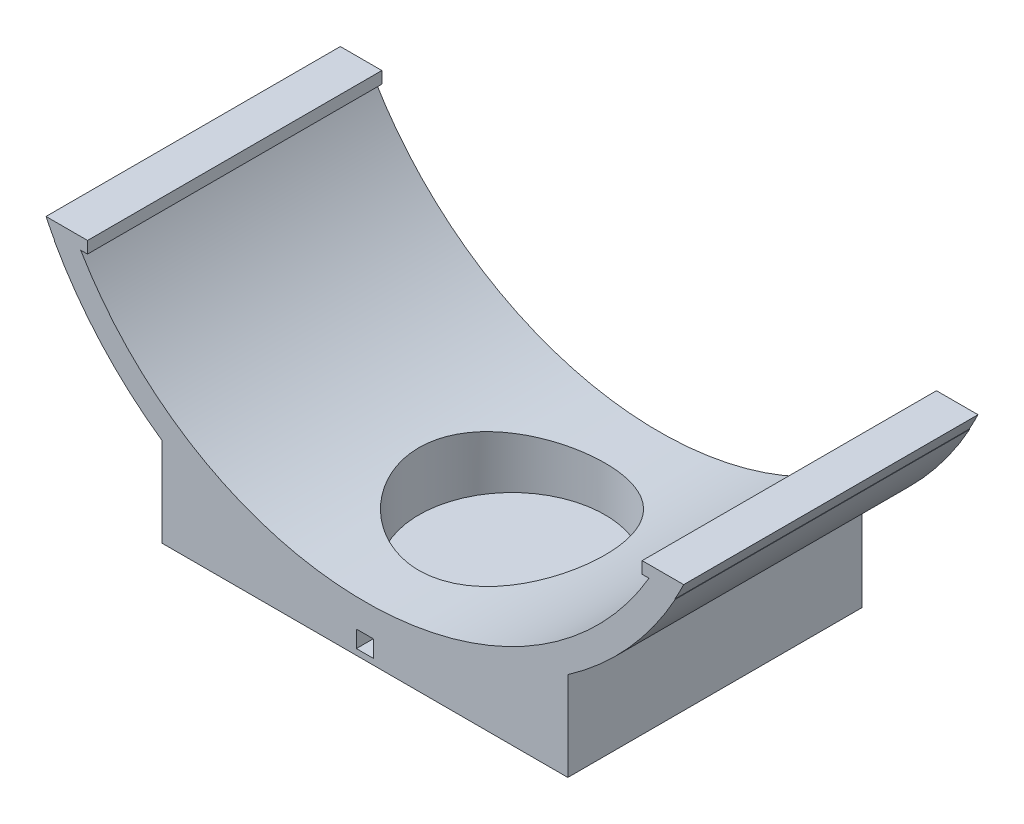
ISO-10303-21;
HEADER;
FILE_DESCRIPTION(('STEP AP214'),'2;1');
FILE_NAME('part.step','',(''),(''),'','','');
FILE_SCHEMA(('AUTOMOTIVE_DESIGN { 1 0 10303 214 1 1 1 1 }'));
ENDSEC;
DATA;
#1=APPLICATION_CONTEXT('core data for automotive mechanical design processes');
#2=APPLICATION_PROTOCOL_DEFINITION('international standard','automotive_design',2000,#1);
#3=PRODUCT_CONTEXT('',#1,'mechanical');
#4=PRODUCT('Part','Part','',(#3));
#5=PRODUCT_RELATED_PRODUCT_CATEGORY('part','',(#4));
#6=PRODUCT_DEFINITION_FORMATION('','',#4);
#7=PRODUCT_DEFINITION_CONTEXT('part definition',#1,'design');
#8=PRODUCT_DEFINITION('design','',#6,#7);
#9=PRODUCT_DEFINITION_SHAPE('','',#8);
#10=(LENGTH_UNIT() NAMED_UNIT(*) SI_UNIT(.MILLI.,.METRE.));
#11=(NAMED_UNIT(*) PLANE_ANGLE_UNIT() SI_UNIT($,.RADIAN.));
#12=(NAMED_UNIT(*) SI_UNIT($,.STERADIAN.) SOLID_ANGLE_UNIT());
#13=UNCERTAINTY_MEASURE_WITH_UNIT(LENGTH_MEASURE(1.E-05),#10,'distance_accuracy_value','');
#14=(GEOMETRIC_REPRESENTATION_CONTEXT(3) GLOBAL_UNCERTAINTY_ASSIGNED_CONTEXT((#13)) GLOBAL_UNIT_ASSIGNED_CONTEXT((#10,
#11,#12)) REPRESENTATION_CONTEXT('',''));
#15=CARTESIAN_POINT('',(0.,0.,0.));
#16=DIRECTION('',(0.,0.,1.));
#17=DIRECTION('',(1.,0.,0.));
#18=AXIS2_PLACEMENT_3D('',#15,#16,#17);
#19=CARTESIAN_POINT('',(0.,0.,174.));
#20=DIRECTION('',(0.,0.,1.));
#21=DIRECTION('',(1.,0.,0.));
#22=AXIS2_PLACEMENT_3D('',#19,#20,#21);
#23=PLANE('',#22);
#24=DIRECTION('',(0.,1.,0.));
#25=VECTOR('',#24,1.);
#26=CARTESIAN_POINT('',(-120.,0.,174.));
#27=LINE('',#26,#25);
#28=CARTESIAN_POINT('',(-120.,-225.,174.));
#29=VERTEX_POINT('',#28);
#30=CARTESIAN_POINT('',(-120.,-172.336879396141,174.));
#31=VERTEX_POINT('',#30);
#32=EDGE_CURVE('E302',#29,#31,#27,.T.);
#33=ORIENTED_EDGE('',*,*,#32,.F.);
#34=DIRECTION('',(1.,0.,0.));
#35=VECTOR('',#34,1.);
#36=CARTESIAN_POINT('',(0.,-225.,174.));
#37=LINE('',#36,#35);
#38=CARTESIAN_POINT('',(120.,-225.,174.));
#39=VERTEX_POINT('',#38);
#40=EDGE_CURVE('E217',#29,#39,#37,.T.);
#41=ORIENTED_EDGE('',*,*,#40,.T.);
#42=DIRECTION('',(0.,1.,0.));
#43=VECTOR('',#42,1.);
#44=CARTESIAN_POINT('',(120.,0.,174.));
#45=LINE('',#44,#43);
#46=CARTESIAN_POINT('',(120.,-172.336879396141,174.));
#47=VERTEX_POINT('',#46);
#48=EDGE_CURVE('E293',#39,#47,#45,.T.);
#49=ORIENTED_EDGE('',*,*,#48,.T.);
#50=CARTESIAN_POINT('',(0.,0.,174.));
#51=DIRECTION('',(0.,0.,1.));
#52=DIRECTION('',(1.,0.,0.));
#53=AXIS2_PLACEMENT_3D('',#50,#51,#52);
#54=CIRCLE('',#53,210.);
#55=CARTESIAN_POINT('',(183.56470248934,-102.,174.));
#56=VERTEX_POINT('',#55);
#57=EDGE_CURVE('E327',#47,#56,#54,.T.);
#58=ORIENTED_EDGE('',*,*,#57,.T.);
#59=DIRECTION('',(1.,0.,0.));
#60=VECTOR('',#59,1.);
#61=CARTESIAN_POINT('',(0.,-102.,174.));
#62=LINE('',#61,#60);
#63=CARTESIAN_POINT('',(183.278647146906,-102.,174.));
#64=VERTEX_POINT('',#63);
#65=EDGE_CURVE('E315',#64,#56,#62,.T.);
#66=ORIENTED_EDGE('',*,*,#65,.F.);
#67=CARTESIAN_POINT('',(0.,0.,174.));
#68=DIRECTION('',(0.,0.,1.));
#69=DIRECTION('',(1.,0.,0.));
#70=AXIS2_PLACEMENT_3D('',#67,#68,#69);
#71=CIRCLE('',#70,209.75);
#72=CARTESIAN_POINT('',(188.496850106308,-92.0000000000001,174.));
#73=VERTEX_POINT('',#72);
#74=EDGE_CURVE('E277',#64,#73,#71,.T.);
#75=ORIENTED_EDGE('',*,*,#74,.T.);
#76=DIRECTION('',(-1.,0.,0.));
#77=VECTOR('',#76,1.);
#78=CARTESIAN_POINT('',(171.933126534708,-92.,174.));
#79=LINE('',#78,#77);
#80=CARTESIAN_POINT('',(163.933126534708,-92.,174.));
#81=VERTEX_POINT('',#80);
#82=EDGE_CURVE('E281',#73,#81,#79,.T.);
#83=ORIENTED_EDGE('',*,*,#82,.T.);
#84=DIRECTION('',(0.,1.,0.));
#85=VECTOR('',#84,1.);
#86=CARTESIAN_POINT('',(163.933126534708,-92.,174.));
#87=LINE('',#86,#85);
#88=CARTESIAN_POINT('',(163.933126534708,-99.,174.));
#89=VERTEX_POINT('',#88);
#90=EDGE_CURVE('E235',#89,#81,#87,.T.);
#91=ORIENTED_EDGE('',*,*,#90,.F.);
#92=DIRECTION('',(-1.,0.,0.));
#93=VECTOR('',#92,1.);
#94=CARTESIAN_POINT('',(163.933126534708,-99.,174.));
#95=LINE('',#94,#93);
#96=CARTESIAN_POINT('',(168.,-99.,174.));
#97=VERTEX_POINT('',#96);
#98=EDGE_CURVE('E229',#97,#89,#95,.T.);
#99=ORIENTED_EDGE('',*,*,#98,.F.);
#100=CARTESIAN_POINT('',(0.,0.,174.));
#101=DIRECTION('',(0.,0.,-1.));
#102=DIRECTION('',(1.,0.,0.));
#103=AXIS2_PLACEMENT_3D('',#100,#101,#102);
#104=CIRCLE('',#103,195.);
#105=CARTESIAN_POINT('',(-168.,-99.,174.));
#106=VERTEX_POINT('',#105);
#107=EDGE_CURVE('E289',#97,#106,#104,.T.);
#108=ORIENTED_EDGE('',*,*,#107,.T.);
#109=DIRECTION('',(-1.,0.,0.));
#110=VECTOR('',#109,1.);
#111=CARTESIAN_POINT('',(-163.933126534708,-99.,174.));
#112=LINE('',#111,#110);
#113=CARTESIAN_POINT('',(-163.933126534708,-99.,174.));
#114=VERTEX_POINT('',#113);
#115=EDGE_CURVE('E252',#114,#106,#112,.T.);
#116=ORIENTED_EDGE('',*,*,#115,.F.);
#117=DIRECTION('',(0.,-1.,0.));
#118=VECTOR('',#117,1.);
#119=CARTESIAN_POINT('',(-163.933126534708,-92.,174.));
#120=LINE('',#119,#118);
#121=CARTESIAN_POINT('',(-163.933126534708,-92.,174.));
#122=VERTEX_POINT('',#121);
#123=EDGE_CURVE('E257',#122,#114,#120,.T.);
#124=ORIENTED_EDGE('',*,*,#123,.F.);
#125=DIRECTION('',(-1.,0.,0.));
#126=VECTOR('',#125,1.);
#127=CARTESIAN_POINT('',(-188.496850106308,-92.,174.));
#128=LINE('',#127,#126);
#129=CARTESIAN_POINT('',(-188.496850106308,-92.,174.));
#130=VERTEX_POINT('',#129);
#131=EDGE_CURVE('E261',#122,#130,#128,.T.);
#132=ORIENTED_EDGE('',*,*,#131,.T.);
#133=CARTESIAN_POINT('',(-183.278647146906,-102.,174.));
#134=VERTEX_POINT('',#133);
#135=EDGE_CURVE('E278',#130,#134,#71,.T.);
#136=ORIENTED_EDGE('',*,*,#135,.T.);
#137=DIRECTION('',(1.,0.,0.));
#138=VECTOR('',#137,1.);
#139=CARTESIAN_POINT('',(0.,-102.,174.));
#140=LINE('',#139,#138);
#141=CARTESIAN_POINT('',(-183.56470248934,-102.,174.));
#142=VERTEX_POINT('',#141);
#143=EDGE_CURVE('E318',#142,#134,#140,.T.);
#144=ORIENTED_EDGE('',*,*,#143,.F.);
#145=EDGE_CURVE('E324',#142,#31,#54,.T.);
#146=ORIENTED_EDGE('',*,*,#145,.T.);
#147=EDGE_LOOP('',(#33,#41,#49,#58,#66,#75,#83,#91,#99,#108,#116,#124,#132,#136,#144,#146));
#148=FACE_BOUND('',#147,.T.);
#149=DIRECTION('',(0.,-1.,0.));
#150=VECTOR('',#149,1.);
#151=CARTESIAN_POINT('',(5.00000000000002,0.,174.));
#152=LINE('',#151,#150);
#153=CARTESIAN_POINT('',(5.,-211.5,174.));
#154=VERTEX_POINT('',#153);
#155=CARTESIAN_POINT('',(5.,-221.5,174.));
#156=VERTEX_POINT('',#155);
#157=EDGE_CURVE('E191',#154,#156,#152,.T.);
#158=ORIENTED_EDGE('',*,*,#157,.T.);
#159=DIRECTION('',(-1.,0.,0.));
#160=VECTOR('',#159,1.);
#161=CARTESIAN_POINT('',(0.,-221.5,174.));
#162=LINE('',#161,#160);
#163=CARTESIAN_POINT('',(-5.,-221.5,174.));
#164=VERTEX_POINT('',#163);
#165=EDGE_CURVE('E59',#156,#164,#162,.T.);
#166=ORIENTED_EDGE('',*,*,#165,.T.);
#167=DIRECTION('',(0.,1.,0.));
#168=VECTOR('',#167,1.);
#169=CARTESIAN_POINT('',(-5.,0.,174.));
#170=LINE('',#169,#168);
#171=CARTESIAN_POINT('',(-5.,-211.5,174.));
#172=VERTEX_POINT('',#171);
#173=EDGE_CURVE('E196',#164,#172,#170,.T.);
#174=ORIENTED_EDGE('',*,*,#173,.T.);
#175=DIRECTION('',(1.,0.,0.));
#176=VECTOR('',#175,1.);
#177=CARTESIAN_POINT('',(0.,-211.5,174.));
#178=LINE('',#177,#176);
#179=EDGE_CURVE('E183',#172,#154,#178,.T.);
#180=ORIENTED_EDGE('',*,*,#179,.T.);
#181=EDGE_LOOP('',(#158,#166,#174,#180));
#182=FACE_BOUND('',#181,.T.);
#183=ADVANCED_FACE('F44',(#148,#182),#23,.T.);
#184=CARTESIAN_POINT('',(0.,-221.5,87.));
#185=DIRECTION('',(0.,1.,0.));
#186=DIRECTION('',(0.,0.,1.));
#187=AXIS2_PLACEMENT_3D('',#184,#185,#186);
#188=CYLINDRICAL_SURFACE('',#187,55.);
#189=CARTESIAN_POINT('',(0.,-195.,142.));
#190=CARTESIAN_POINT('',(1.51277598464168,-194.999997304751,141.999995610297));
#191=CARTESIAN_POINT('',(3.02563306617673,-194.982353560653,141.93753465475));
#192=CARTESIAN_POINT('',(6.04030681610823,-194.912258782389,141.688232088754));
#193=CARTESIAN_POINT('',(7.54212268342941,-194.859805247374,141.501381541749));
#194=CARTESIAN_POINT('',(10.5242864998696,-194.721514711655,141.004861870919));
#195=CARTESIAN_POINT('',(12.0046267379808,-194.635666013523,140.69514971122));
#196=CARTESIAN_POINT('',(14.9327576670529,-194.432936319551,139.955576125098));
#197=CARTESIAN_POINT('',(16.3805488217454,-194.316055766129,139.525716411608));
#198=CARTESIAN_POINT('',(19.2316449690921,-194.054606947669,138.550081244053));
#199=CARTESIAN_POINT('',(20.6350093429244,-193.910077631711,138.004468735609));
#200=CARTESIAN_POINT('',(23.3900720949104,-193.597073533787,136.80124640194));
#201=CARTESIAN_POINT('',(24.7417703476622,-193.428598693706,136.143636304901));
#202=CARTESIAN_POINT('',(27.3849321959632,-193.072121722803,134.72125352611));
#203=CARTESIAN_POINT('',(28.6763923140339,-192.884118466645,133.956474667808));
#204=CARTESIAN_POINT('',(31.1910004963923,-192.493482436804,132.32513389038));
#205=CARTESIAN_POINT('',(32.4141473302252,-192.290849399763,131.458570138783));
#206=CARTESIAN_POINT('',(34.8121052649309,-191.871397239887,129.608255675445));
#207=CARTESIAN_POINT('',(35.985145512741,-191.654358471269,128.62225916456));
#208=CARTESIAN_POINT('',(38.2445264347831,-191.21631917666,126.556283582681));
#209=CARTESIAN_POINT('',(39.3308658605527,-190.995318593676,125.47630315882));
#210=CARTESIAN_POINT('',(41.4100573863605,-190.555337694959,123.229140506784));
#211=CARTESIAN_POINT('',(42.4028965244983,-190.336357663118,122.061946228299));
#212=CARTESIAN_POINT('',(44.2884084378103,-189.906482695444,119.647858408345));
#213=CARTESIAN_POINT('',(45.181080405655,-189.695587824785,118.400964224635));
#214=CARTESIAN_POINT('',(46.8765745407372,-189.283815921787,115.810239545886));
#215=CARTESIAN_POINT('',(47.6772977159791,-189.083215525293,114.464990030597));
#216=CARTESIAN_POINT('',(49.162230637943,-188.702577945346,111.708813244506));
#217=CARTESIAN_POINT('',(49.8464384655657,-188.522541100608,110.297884892409));
#218=CARTESIAN_POINT('',(51.0927350973465,-188.188599218257,107.42034060372));
#219=CARTESIAN_POINT('',(51.6548437850889,-188.034689926722,105.953733780017));
#220=CARTESIAN_POINT('',(52.6522576710364,-187.757844041035,102.97517381577));
#221=CARTESIAN_POINT('',(53.0875668143327,-187.634906483282,101.46322208765));
#222=CARTESIAN_POINT('',(53.8181863976163,-187.426635157743,98.4435623179981));
#223=CARTESIAN_POINT('',(54.1167289707947,-187.340437004747,96.936695711525));
#224=CARTESIAN_POINT('',(54.586856670881,-187.203993562236,93.9016672922743));
#225=CARTESIAN_POINT('',(54.75844373239,-187.153747724864,92.3735058043586));
#226=CARTESIAN_POINT('',(54.9730432374301,-187.090825739297,89.3076899008145));
#227=CARTESIAN_POINT('',(55.0160792915418,-187.078142692059,87.7700372803878));
#228=CARTESIAN_POINT('',(54.9732343190708,-187.09073748328,84.6967010099465));
#229=CARTESIAN_POINT('',(54.887355681379,-187.116014618306,83.1610173239737));
#230=CARTESIAN_POINT('',(54.5922403009783,-187.202323309921,80.1515882440086));
#231=CARTESIAN_POINT('',(54.3869816817835,-187.262201453032,78.6774175080696));
#232=CARTESIAN_POINT('',(53.8581194766046,-187.41499037387,75.7522458772274));
#233=CARTESIAN_POINT('',(53.5345187495676,-187.507900353601,74.3012444234769));
#234=CARTESIAN_POINT('',(52.7716565927596,-187.724024039912,71.4322191048295));
#235=CARTESIAN_POINT('',(52.3323881639886,-187.847239580238,70.0141972411653));
#236=CARTESIAN_POINT('',(51.3416985166608,-188.120423591712,67.2205508089576));
#237=CARTESIAN_POINT('',(50.7902750928457,-188.270392588895,65.8449270746838));
#238=CARTESIAN_POINT('',(49.5719407427942,-188.594869390542,63.1281257936024));
#239=CARTESIAN_POINT('',(48.9036859021021,-188.769657733188,61.7875846456117));
#240=CARTESIAN_POINT('',(47.4613520849324,-189.137446531583,59.1673453312611));
#241=CARTESIAN_POINT('',(46.6872726568405,-189.330447065053,57.8876474245857));
#242=CARTESIAN_POINT('',(45.0384344896766,-189.729435603099,55.3966655699284));
#243=CARTESIAN_POINT('',(44.1636575337009,-189.935425954569,54.1853940600432));
#244=CARTESIAN_POINT('',(42.3192039321344,-190.354877199058,51.838767050779));
#245=CARTESIAN_POINT('',(41.3495249884407,-190.568338272905,50.7034133909127));
#246=CARTESIAN_POINT('',(39.2840355631165,-191.005023396751,48.475253402716));
#247=CARTESIAN_POINT('',(38.1849013302693,-191.228318156092,47.3855395329822));
#248=CARTESIAN_POINT('',(35.8982517288536,-191.67073699137,45.3021832093801));
#249=CARTESIAN_POINT('',(34.7107341671541,-191.889860963646,44.3085431408805));
#250=CARTESIAN_POINT('',(32.2549075063342,-192.317899025981,42.4240354736116));
#251=CARTESIAN_POINT('',(30.9865936554316,-192.526812514263,41.5331739281184));
#252=CARTESIAN_POINT('',(28.3774891485624,-192.928639740406,39.8606401400473));
#253=CARTESIAN_POINT('',(27.0366989896612,-193.121553587973,39.0789671487516));
#254=CARTESIAN_POINT('',(24.2841503406643,-193.486995820346,37.626785886393));
#255=CARTESIAN_POINT('',(22.872049070732,-193.659409035535,36.9568978383738));
#256=CARTESIAN_POINT('',(19.9933641479954,-193.977736178376,35.7388260939951));
#257=CARTESIAN_POINT('',(18.5267800671251,-194.123649897772,35.1906433540984));
#258=CARTESIAN_POINT('',(15.5499999242052,-194.384745205353,34.2207670888056));
#259=CARTESIAN_POINT('',(14.0398126256082,-194.499932921909,33.7990483377956));
#260=CARTESIAN_POINT('',(10.9868456927494,-194.696246881347,33.0857502506882));
#261=CARTESIAN_POINT('',(9.44406710114175,-194.777374212154,32.7941667579131));
#262=CARTESIAN_POINT('',(6.38759737955367,-194.901161078377,32.3510633816287));
#263=CARTESIAN_POINT('',(4.87455911709058,-194.94497035096,32.1953533234206));
#264=CARTESIAN_POINT('',(1.84018665814559,-194.997220478891,32.0097825472414));
#265=CARTESIAN_POINT('',(0.318852639704865,-195.005662090324,31.9799191389463));
#266=CARTESIAN_POINT('',(-2.72067114375175,-194.986942029158,32.0463054967055));
#267=CARTESIAN_POINT('',(-4.23886122557451,-194.959784138108,32.1425418678469));
#268=CARTESIAN_POINT('',(-7.26103653739713,-194.870630723845,32.4602353545998));
#269=CARTESIAN_POINT('',(-8.765021849285,-194.808635401589,32.6816917478914));
#270=CARTESIAN_POINT('',(-11.7185674550566,-194.653074412565,33.2423005147627));
#271=CARTESIAN_POINT('',(-13.1686167043497,-194.560151370275,33.5790608624129));
#272=CARTESIAN_POINT('',(-16.0346101227006,-194.344941863136,34.3682562724752));
#273=CARTESIAN_POINT('',(-17.4505548668401,-194.222655893797,34.8206893828778));
#274=CARTESIAN_POINT('',(-20.239101414165,-193.951905110252,35.837693591339));
#275=CARTESIAN_POINT('',(-21.6116996780089,-193.803438164791,36.4022738191746));
#276=CARTESIAN_POINT('',(-24.3046889918928,-193.484162013078,37.6393085686977));
#277=CARTESIAN_POINT('',(-25.6250788776387,-193.313352308927,38.3117654944437));
#278=CARTESIAN_POINT('',(-28.2329132181185,-192.949922490515,39.7751609714886));
#279=CARTESIAN_POINT('',(-29.519061548626,-192.756916069748,40.5683133943173));
#280=CARTESIAN_POINT('',(-32.0203400821098,-192.35722551291,42.2565691287422));
#281=CARTESIAN_POINT('',(-33.235469482682,-192.150541222357,43.1516735919021));
#282=CARTESIAN_POINT('',(-35.5874725145358,-191.728870384718,45.0380551409026));
#283=CARTESIAN_POINT('',(-36.7243310563164,-191.513882249171,46.0293506827473));
#284=CARTESIAN_POINT('',(-38.9125867826961,-191.081278017958,48.1016524547747));
#285=CARTESIAN_POINT('',(-39.9639823382036,-190.863661872288,49.1826603942576));
#286=CARTESIAN_POINT('',(-42.0068287968446,-190.424663688709,51.4634820536823));
#287=CARTESIAN_POINT('',(-42.9953032651288,-190.203382512631,52.6659833901291));
#288=CARTESIAN_POINT('',(-44.8675674807035,-189.770453355497,55.151572228421));
#289=CARTESIAN_POINT('',(-45.7513547796848,-189.558805599808,56.4346616138977));
#290=CARTESIAN_POINT('',(-47.4079032742508,-189.151311295467,59.0730086424281));
#291=CARTESIAN_POINT('',(-48.1806657935975,-188.95546455843,60.4282654247568));
#292=CARTESIAN_POINT('',(-49.609306663953,-188.585422348909,63.2018895610344));
#293=CARTESIAN_POINT('',(-50.2651868880261,-188.41122652948,64.6202559031836));
#294=CARTESIAN_POINT('',(-51.4515194101969,-188.090714591469,67.5024025647285));
#295=CARTESIAN_POINT('',(-51.9826387878447,-187.944251048306,68.9658917148034));
#296=CARTESIAN_POINT('',(-52.9195244587185,-187.682606546131,71.935223920435));
#297=CARTESIAN_POINT('',(-53.32529079328,-187.567425576802,73.4410669620252));
#298=CARTESIAN_POINT('',(-54.0077324467009,-187.372065704206,76.4835904167211));
#299=CARTESIAN_POINT('',(-54.2844395155644,-187.291878192473,78.0202631482542));
#300=CARTESIAN_POINT('',(-54.706299470099,-187.169092825265,81.113035288433));
#301=CARTESIAN_POINT('',(-54.8514566322037,-187.126493747863,82.6691340639081));
#302=CARTESIAN_POINT('',(-55.0059350885892,-187.081140474726,85.7311540434134));
#303=CARTESIAN_POINT('',(-55.0200592029773,-187.07697748964,87.2368141228749));
#304=CARTESIAN_POINT('',(-54.9248583842064,-187.104950316674,90.2438606326164));
#305=CARTESIAN_POINT('',(-54.8155366395511,-187.137085191252,91.7452471722744));
#306=CARTESIAN_POINT('',(-54.474438998226,-187.236660182412,94.7327825235859));
#307=CARTESIAN_POINT('',(-54.242667739981,-187.304098961669,96.2189319102538));
#308=CARTESIAN_POINT('',(-53.6587131692459,-187.472223660234,99.1654548680127));
#309=CARTESIAN_POINT('',(-53.306529257297,-187.572909745057,100.625828310743));
#310=CARTESIAN_POINT('',(-52.4887374259627,-187.803383553097,103.496617769752));
#311=CARTESIAN_POINT('',(-52.0242661681516,-187.932878661644,104.907381560932));
#312=CARTESIAN_POINT('',(-50.9838485852516,-188.217793669274,107.684434863653));
#313=CARTESIAN_POINT('',(-50.4079034401043,-188.373213293946,109.050724845765));
#314=CARTESIAN_POINT('',(-49.1487429468255,-188.705656652546,111.730405540767));
#315=CARTESIAN_POINT('',(-48.4655133229456,-188.882683260896,113.043789184439));
#316=CARTESIAN_POINT('',(-46.9966216973714,-189.253510163334,115.609488643802));
#317=CARTESIAN_POINT('',(-46.2109569467775,-189.447310907518,116.861802819423));
#318=CARTESIAN_POINT('',(-44.5151536149936,-189.853062976584,119.337676095336));
#319=CARTESIAN_POINT('',(-43.6017904708369,-190.065400173821,120.558964323428));
#320=CARTESIAN_POINT('',(-41.6774853507142,-190.496612007318,122.920853720066));
#321=CARTESIAN_POINT('',(-40.66654134687,-190.715486779373,124.061453210924));
#322=CARTESIAN_POINT('',(-38.5533331692757,-191.153877639405,126.255068471827));
#323=CARTESIAN_POINT('',(-37.4510474753336,-191.373393866689,127.308063484396));
#324=CARTESIAN_POINT('',(-35.1622995871373,-191.807114286307,129.319424849606));
#325=CARTESIAN_POINT('',(-33.975836966903,-192.021318451751,130.277790723315));
#326=CARTESIAN_POINT('',(-31.4957016907239,-192.443866652879,132.116095107206));
#327=CARTESIAN_POINT('',(-30.2000984393956,-192.651933098431,132.993495252527));
#328=CARTESIAN_POINT('',(-27.5368111149729,-193.05060678832,134.63582320654));
#329=CARTESIAN_POINT('',(-26.169123975991,-193.241213289103,135.400746226079));
#330=CARTESIAN_POINT('',(-23.3717389221184,-193.599455338112,136.811793217101));
#331=CARTESIAN_POINT('',(-21.9420720610811,-193.76710221867,137.457975850282));
#332=CARTESIAN_POINT('',(-19.0302533374737,-194.074706450383,138.626638816058));
#333=CARTESIAN_POINT('',(-17.5481076720372,-194.21466705819,139.149133699094));
#334=CARTESIAN_POINT('',(-14.7498370514193,-194.445706299648,140.002612249688));
#335=CARTESIAN_POINT('',(-13.4390480304431,-194.540866112287,140.350078116561));
#336=CARTESIAN_POINT('',(-10.793930863323,-194.705537511506,140.947464884264));
#337=CARTESIAN_POINT('',(-9.45960527280495,-194.775051864951,141.197396308171));
#338=CARTESIAN_POINT('',(-6.77514063970241,-194.88689524458,141.597975951774));
#339=CARTESIAN_POINT('',(-5.42500326360649,-194.929227109878,141.748634540207));
#340=CARTESIAN_POINT('',(-2.71659953508749,-194.985781967651,141.949653066806));
#341=CARTESIAN_POINT('',(-1.35833245921605,-195.000002420084,142.000003941546));
#342=CARTESIAN_POINT('',(0.,-195.,142.));
#343=B_SPLINE_CURVE_WITH_KNOTS('',3,(#189,#190,#191,#192,#193,#194,#195,#196,#197,#198,#199,
#200,#201,#202,#203,#204,#205,#206,#207,#208,#209,#210,#211,#212,#213,#214,#215,#216,#217,#218,
#219,#220,#221,#222,#223,#224,#225,#226,#227,#228,#229,#230,#231,#232,#233,#234,#235,#236,#237,
#238,#239,#240,#241,#242,#243,#244,#245,#246,#247,#248,#249,#250,#251,#252,#253,#254,#255,#256,
#257,#258,#259,#260,#261,#262,#263,#264,#265,#266,#267,#268,#269,#270,#271,#272,#273,#274,#275,
#276,#277,#278,#279,#280,#281,#282,#283,#284,#285,#286,#287,#288,#289,#290,#291,#292,#293,#294,
#295,#296,#297,#298,#299,#300,#301,#302,#303,#304,#305,#306,#307,#308,#309,#310,#311,#312,#313,
#314,#315,#316,#317,#318,#319,#320,#321,#322,#323,#324,#325,#326,#327,#328,#329,#330,#331,#332,
#333,#334,#335,#336,#337,#338,#339,#340,#341,#342),.UNSPECIFIED.,.T.,.F.,(4,2,2,2,2,2,2,2,2,2,2,
2,2,2,2,2,2,2,2,2,2,2,2,2,2,2,2,2,2,2,2,2,2,2,2,2,2,2,2,2,2,2,2,2,2,2,2,2,2,2,2,2,2,2,2,2,2,2,2,
2,2,2,2,2,2,2,2,2,2,2,2,2,2,2,2,2,4),(0.,4.53708199552157,9.07448998504358,13.6134887398362,
18.1524227858136,22.6850092589732,27.2176067327461,31.7504655451402,36.2834059768057,
40.9211271113907,45.5589150155437,50.197344910504,54.835812187691,59.5650078593128,
64.2942814169713,69.0227842441797,73.7511399386241,78.3611174003492,82.9710246118645,
87.5800850833786,92.1890601464245,96.6525972976513,101.116026624422,105.579726093363,
110.043513338709,114.562504972605,119.081515892236,123.601345621908,128.121284828783,
132.80716953111,137.493170547082,142.179447410498,146.865692138025,151.577130512371,
156.28860591185,160.99914089314,165.709525403472,170.268916812972,174.828210752236,
179.387020421064,183.945803793097,188.415231042029,192.88458287313,197.35429869862,
201.824114146662,206.388902897175,210.953743212778,215.51946111419,220.085266026704,
224.796514789388,229.507873711867,234.219176455568,238.930403692821,243.615836081421,
248.301266924986,252.985544492066,257.669669776858,262.18139537959,266.693004450877,
271.204442633299,275.715903275666,280.183478519555,284.651006477133,289.119129408338,
293.587372268618,298.20138291234,302.815489462845,307.430686209123,312.04590631243,
316.775727940309,321.505750900575,326.233430752597,330.960554170728,335.034930030026,
339.108866179737,343.182376752053,347.256255374672),.UNSPECIFIED.);
#344=CARTESIAN_POINT('',(0.,-195.,142.));
#345=VERTEX_POINT('',#344);
#346=EDGE_CURVE('E212',#345,#345,#343,.T.);
#347=ORIENTED_EDGE('',*,*,#346,.T.);
#348=EDGE_LOOP('',(#347));
#349=FACE_BOUND('',#348,.T.);
#350=DIRECTION('',(0.,1.,0.));
#351=VECTOR('',#350,1.);
#352=CARTESIAN_POINT('',(-5.,-221.5,141.772255750517));
#353=LINE('',#352,#351);
#354=CARTESIAN_POINT('',(-5.,-221.5,141.772255750517));
#355=VERTEX_POINT('',#354);
#356=CARTESIAN_POINT('',(-5.,-211.5,141.772255750517));
#357=VERTEX_POINT('',#356);
#358=EDGE_CURVE('E207',#355,#357,#353,.T.);
#359=ORIENTED_EDGE('',*,*,#358,.F.);
#360=CARTESIAN_POINT('',(0.,-221.5,87.));
#361=DIRECTION('',(0.,1.,0.));
#362=DIRECTION('',(0.,0.,1.));
#363=AXIS2_PLACEMENT_3D('',#360,#361,#362);
#364=CIRCLE('',#363,55.);
#365=CARTESIAN_POINT('',(5.,-221.5,141.772255750517));
#366=VERTEX_POINT('',#365);
#367=EDGE_CURVE('E209',#366,#355,#364,.T.);
#368=ORIENTED_EDGE('',*,*,#367,.F.);
#369=DIRECTION('',(0.,1.,0.));
#370=VECTOR('',#369,1.);
#371=CARTESIAN_POINT('',(5.,-221.5,141.772255750517));
#372=LINE('',#371,#370);
#373=CARTESIAN_POINT('',(5.,-211.5,141.772255750517));
#374=VERTEX_POINT('',#373);
#375=EDGE_CURVE('E203',#374,#366,#372,.F.);
#376=ORIENTED_EDGE('',*,*,#375,.F.);
#377=CARTESIAN_POINT('',(0.,-211.5,87.));
#378=DIRECTION('',(0.,-1.,0.));
#379=DIRECTION('',(0.,0.,-1.));
#380=AXIS2_PLACEMENT_3D('',#377,#378,#379);
#381=CIRCLE('',#380,55.);
#382=EDGE_CURVE('E12',#357,#374,#381,.F.);
#383=ORIENTED_EDGE('',*,*,#382,.F.);
#384=EDGE_LOOP('',(#359,#368,#376,#383));
#385=FACE_BOUND('',#384,.T.);
#386=ADVANCED_FACE('F339',(#349,#385),#188,.F.);
#387=CARTESIAN_POINT('',(0.,0.,174.));
#388=DIRECTION('',(0.,0.,-1.));
#389=DIRECTION('',(-1.,0.,0.));
#390=AXIS2_PLACEMENT_3D('',#387,#388,#389);
#391=CYLINDRICAL_SURFACE('',#390,210.);
#392=ORIENTED_EDGE('',*,*,#57,.F.);
#393=DIRECTION('',(0.,0.,1.));
#394=VECTOR('',#393,1.);
#395=CARTESIAN_POINT('',(120.,-172.336879396141,-115.957504903706));
#396=LINE('',#395,#394);
#397=CARTESIAN_POINT('',(120.,-172.336879396141,0.));
#398=VERTEX_POINT('',#397);
#399=EDGE_CURVE('E297',#398,#47,#396,.T.);
#400=ORIENTED_EDGE('',*,*,#399,.F.);
#401=CARTESIAN_POINT('',(0.,0.,0.));
#402=DIRECTION('',(0.,0.,1.));
#403=DIRECTION('',(1.,0.,0.));
#404=AXIS2_PLACEMENT_3D('',#401,#402,#403);
#405=CIRCLE('',#404,210.);
#406=CARTESIAN_POINT('',(183.56470248934,-102.,0.));
#407=VERTEX_POINT('',#406);
#408=EDGE_CURVE('E322',#398,#407,#405,.T.);
#409=ORIENTED_EDGE('',*,*,#408,.T.);
#410=DIRECTION('',(0.,0.,-1.));
#411=VECTOR('',#410,1.);
#412=CARTESIAN_POINT('',(183.56470248934,-102.,174.));
#413=LINE('',#412,#411);
#414=EDGE_CURVE('E312',#407,#56,#413,.F.);
#415=ORIENTED_EDGE('',*,*,#414,.T.);
#416=EDGE_LOOP('',(#392,#400,#409,#415));
#417=FACE_BOUND('',#416,.T.);
#418=ADVANCED_FACE('F46',(#417),#391,.T.);
#419=DIRECTION('',(0.,0.,1.));
#420=VECTOR('',#419,1.);
#421=CARTESIAN_POINT('',(-120.,-172.336879396141,-115.957504903706));
#422=LINE('',#421,#420);
#423=CARTESIAN_POINT('',(-120.,-172.336879396141,0.));
#424=VERTEX_POINT('',#423);
#425=EDGE_CURVE('E306',#424,#31,#422,.T.);
#426=ORIENTED_EDGE('',*,*,#425,.T.);
#427=ORIENTED_EDGE('',*,*,#145,.F.);
#428=DIRECTION('',(0.,0.,-1.));
#429=VECTOR('',#428,1.);
#430=CARTESIAN_POINT('',(-183.56470248934,-102.,174.));
#431=LINE('',#430,#429);
#432=CARTESIAN_POINT('',(-183.56470248934,-102.,0.));
#433=VERTEX_POINT('',#432);
#434=EDGE_CURVE('E305',#142,#433,#431,.T.);
#435=ORIENTED_EDGE('',*,*,#434,.T.);
#436=EDGE_CURVE('E328',#433,#424,#405,.T.);
#437=ORIENTED_EDGE('',*,*,#436,.T.);
#438=EDGE_LOOP('',(#426,#427,#435,#437));
#439=FACE_BOUND('',#438,.T.);
#440=ADVANCED_FACE('F391',(#439),#391,.T.);
#441=CARTESIAN_POINT('',(0.,0.,0.));
#442=DIRECTION('',(0.,0.,1.));
#443=DIRECTION('',(1.,0.,0.));
#444=AXIS2_PLACEMENT_3D('',#441,#442,#443);
#445=PLANE('',#444);
#446=CARTESIAN_POINT('',(0.,0.,0.));
#447=DIRECTION('',(0.,0.,1.));
#448=DIRECTION('',(1.,0.,0.));
#449=AXIS2_PLACEMENT_3D('',#446,#447,#448);
#450=CIRCLE('',#449,195.);
#451=CARTESIAN_POINT('',(-168.,-99.,0.));
#452=VERTEX_POINT('',#451);
#453=CARTESIAN_POINT('',(168.,-99.,0.));
#454=VERTEX_POINT('',#453);
#455=EDGE_CURVE('E290',#452,#454,#450,.T.);
#456=ORIENTED_EDGE('',*,*,#455,.T.);
#457=DIRECTION('',(-1.,0.,0.));
#458=VECTOR('',#457,1.);
#459=CARTESIAN_POINT('',(163.933126534708,-99.,0.));
#460=LINE('',#459,#458);
#461=CARTESIAN_POINT('',(163.933126534708,-99.,0.));
#462=VERTEX_POINT('',#461);
#463=EDGE_CURVE('E223',#454,#462,#460,.T.);
#464=ORIENTED_EDGE('',*,*,#463,.T.);
#465=DIRECTION('',(0.,1.,0.));
#466=VECTOR('',#465,1.);
#467=CARTESIAN_POINT('',(163.933126534708,-92.,0.));
#468=LINE('',#467,#466);
#469=CARTESIAN_POINT('',(163.933126534708,-92.,0.));
#470=VERTEX_POINT('',#469);
#471=EDGE_CURVE('E226',#462,#470,#468,.T.);
#472=ORIENTED_EDGE('',*,*,#471,.T.);
#473=DIRECTION('',(1.,0.,0.));
#474=VECTOR('',#473,1.);
#475=CARTESIAN_POINT('',(171.933126534708,-92.,0.));
#476=LINE('',#475,#474);
#477=CARTESIAN_POINT('',(188.496850106308,-92.0000000000001,0.));
#478=VERTEX_POINT('',#477);
#479=EDGE_CURVE('E272',#470,#478,#476,.T.);
#480=ORIENTED_EDGE('',*,*,#479,.T.);
#481=CARTESIAN_POINT('',(0.,0.,0.));
#482=DIRECTION('',(0.,0.,1.));
#483=DIRECTION('',(1.,0.,0.));
#484=AXIS2_PLACEMENT_3D('',#481,#482,#483);
#485=CIRCLE('',#484,209.75);
#486=CARTESIAN_POINT('',(183.278647146906,-102.,0.));
#487=VERTEX_POINT('',#486);
#488=EDGE_CURVE('E269',#478,#487,#485,.F.);
#489=ORIENTED_EDGE('',*,*,#488,.T.);
#490=DIRECTION('',(-1.,0.,0.));
#491=VECTOR('',#490,1.);
#492=CARTESIAN_POINT('',(0.,-102.,0.));
#493=LINE('',#492,#491);
#494=EDGE_CURVE('E316',#407,#487,#493,.T.);
#495=ORIENTED_EDGE('',*,*,#494,.F.);
#496=ORIENTED_EDGE('',*,*,#408,.F.);
#497=DIRECTION('',(0.,-1.,0.));
#498=VECTOR('',#497,1.);
#499=CARTESIAN_POINT('',(120.,0.,0.));
#500=LINE('',#499,#498);
#501=CARTESIAN_POINT('',(120.,-225.,0.));
#502=VERTEX_POINT('',#501);
#503=EDGE_CURVE('E300',#398,#502,#500,.T.);
#504=ORIENTED_EDGE('',*,*,#503,.T.);
#505=DIRECTION('',(1.,0.,0.));
#506=VECTOR('',#505,1.);
#507=CARTESIAN_POINT('',(0.,-225.,0.));
#508=LINE('',#507,#506);
#509=CARTESIAN_POINT('',(-120.,-225.,0.));
#510=VERTEX_POINT('',#509);
#511=EDGE_CURVE('E213',#510,#502,#508,.T.);
#512=ORIENTED_EDGE('',*,*,#511,.F.);
#513=DIRECTION('',(0.,-1.,0.));
#514=VECTOR('',#513,1.);
#515=CARTESIAN_POINT('',(-120.,0.,0.));
#516=LINE('',#515,#514);
#517=EDGE_CURVE('E303',#424,#510,#516,.T.);
#518=ORIENTED_EDGE('',*,*,#517,.F.);
#519=ORIENTED_EDGE('',*,*,#436,.F.);
#520=DIRECTION('',(-1.,0.,0.));
#521=VECTOR('',#520,1.);
#522=CARTESIAN_POINT('',(0.,-102.,0.));
#523=LINE('',#522,#521);
#524=CARTESIAN_POINT('',(-183.278647146906,-102.,0.));
#525=VERTEX_POINT('',#524);
#526=EDGE_CURVE('E320',#525,#433,#523,.T.);
#527=ORIENTED_EDGE('',*,*,#526,.F.);
#528=CARTESIAN_POINT('',(-188.496850106308,-92.,0.));
#529=VERTEX_POINT('',#528);
#530=EDGE_CURVE('E267',#525,#529,#485,.F.);
#531=ORIENTED_EDGE('',*,*,#530,.T.);
#532=DIRECTION('',(1.,0.,0.));
#533=VECTOR('',#532,1.);
#534=CARTESIAN_POINT('',(-188.496850106308,-92.,0.));
#535=LINE('',#534,#533);
#536=CARTESIAN_POINT('',(-163.933126534708,-92.,0.));
#537=VERTEX_POINT('',#536);
#538=EDGE_CURVE('E265',#529,#537,#535,.T.);
#539=ORIENTED_EDGE('',*,*,#538,.T.);
#540=DIRECTION('',(0.,-1.,0.));
#541=VECTOR('',#540,1.);
#542=CARTESIAN_POINT('',(-163.933126534708,-92.,0.));
#543=LINE('',#542,#541);
#544=CARTESIAN_POINT('',(-163.933126534708,-99.,0.));
#545=VERTEX_POINT('',#544);
#546=EDGE_CURVE('E245',#537,#545,#543,.T.);
#547=ORIENTED_EDGE('',*,*,#546,.T.);
#548=DIRECTION('',(-1.,0.,0.));
#549=VECTOR('',#548,1.);
#550=CARTESIAN_POINT('',(-163.933126534708,-99.,0.));
#551=LINE('',#550,#549);
#552=EDGE_CURVE('E246',#545,#452,#551,.T.);
#553=ORIENTED_EDGE('',*,*,#552,.T.);
#554=EDGE_LOOP('',(#456,#464,#472,#480,#489,#495,#496,#504,#512,#518,#519,#527,#531,#539,#547,#553));
#555=FACE_BOUND('',#554,.T.);
#556=ADVANCED_FACE('F389',(#555),#445,.F.);
#557=CARTESIAN_POINT('',(0.,-102.,-5.64183047049638));
#558=DIRECTION('',(0.,-1.,0.));
#559=DIRECTION('',(0.,0.,-1.));
#560=AXIS2_PLACEMENT_3D('',#557,#558,#559);
#561=PLANE('',#560);
#562=ORIENTED_EDGE('',*,*,#143,.T.);
#563=DIRECTION('',(0.,0.,1.));
#564=VECTOR('',#563,1.);
#565=CARTESIAN_POINT('',(-183.278647146906,-102.,-394.954823365914));
#566=LINE('',#565,#564);
#567=EDGE_CURVE('E274',#134,#525,#566,.F.);
#568=ORIENTED_EDGE('',*,*,#567,.T.);
#569=ORIENTED_EDGE('',*,*,#526,.T.);
#570=ORIENTED_EDGE('',*,*,#434,.F.);
#571=EDGE_LOOP('',(#562,#568,#569,#570));
#572=FACE_BOUND('',#571,.T.);
#573=ADVANCED_FACE('F387',(#572),#561,.F.);
#574=CARTESIAN_POINT('',(0.,-102.,-5.64183047049638));
#575=DIRECTION('',(0.,-1.,0.));
#576=DIRECTION('',(0.,0.,-1.));
#577=AXIS2_PLACEMENT_3D('',#574,#575,#576);
#578=PLANE('',#577);
#579=ORIENTED_EDGE('',*,*,#494,.T.);
#580=DIRECTION('',(0.,0.,1.));
#581=VECTOR('',#580,1.);
#582=CARTESIAN_POINT('',(183.278647146906,-102.,-394.954823365914));
#583=LINE('',#582,#581);
#584=EDGE_CURVE('E52',#487,#64,#583,.T.);
#585=ORIENTED_EDGE('',*,*,#584,.T.);
#586=ORIENTED_EDGE('',*,*,#65,.T.);
#587=ORIENTED_EDGE('',*,*,#414,.F.);
#588=EDGE_LOOP('',(#579,#585,#586,#587));
#589=FACE_BOUND('',#588,.T.);
#590=ADVANCED_FACE('F397',(#589),#578,.F.);
#591=CARTESIAN_POINT('',(-120.,0.,-115.957504903706));
#592=DIRECTION('',(1.,0.,0.));
#593=DIRECTION('',(0.,0.,-1.));
#594=AXIS2_PLACEMENT_3D('',#591,#592,#593);
#595=PLANE('',#594);
#596=ORIENTED_EDGE('',*,*,#425,.F.);
#597=ORIENTED_EDGE('',*,*,#517,.T.);
#598=DIRECTION('',(0.,0.,1.));
#599=VECTOR('',#598,1.);
#600=CARTESIAN_POINT('',(-120.,-225.,0.));
#601=LINE('',#600,#599);
#602=EDGE_CURVE('E220',#510,#29,#601,.T.);
#603=ORIENTED_EDGE('',*,*,#602,.T.);
#604=ORIENTED_EDGE('',*,*,#32,.T.);
#605=EDGE_LOOP('',(#596,#597,#603,#604));
#606=FACE_BOUND('',#605,.T.);
#607=ADVANCED_FACE('F434',(#606),#595,.F.);
#608=CARTESIAN_POINT('',(120.,0.,-115.957504903706));
#609=DIRECTION('',(1.,0.,0.));
#610=DIRECTION('',(0.,0.,-1.));
#611=AXIS2_PLACEMENT_3D('',#608,#609,#610);
#612=PLANE('',#611);
#613=ORIENTED_EDGE('',*,*,#503,.F.);
#614=ORIENTED_EDGE('',*,*,#399,.T.);
#615=ORIENTED_EDGE('',*,*,#48,.F.);
#616=DIRECTION('',(0.,0.,1.));
#617=VECTOR('',#616,1.);
#618=CARTESIAN_POINT('',(120.,-225.,0.));
#619=LINE('',#618,#617);
#620=EDGE_CURVE('E216',#502,#39,#619,.T.);
#621=ORIENTED_EDGE('',*,*,#620,.F.);
#622=EDGE_LOOP('',(#613,#614,#615,#621));
#623=FACE_BOUND('',#622,.T.);
#624=ADVANCED_FACE('F427',(#623),#612,.T.);
#625=CARTESIAN_POINT('',(0.,0.,-365.268394471791));
#626=DIRECTION('',(0.,0.,1.));
#627=DIRECTION('',(1.,0.,0.));
#628=AXIS2_PLACEMENT_3D('',#625,#626,#627);
#629=CYLINDRICAL_SURFACE('',#628,195.);
#630=ORIENTED_EDGE('',*,*,#346,.F.);
#631=EDGE_LOOP('',(#630));
#632=FACE_BOUND('',#631,.T.);
#633=DIRECTION('',(0.,0.,-1.));
#634=VECTOR('',#633,1.);
#635=CARTESIAN_POINT('',(168.,-99.,183.45827557051));
#636=LINE('',#635,#634);
#637=EDGE_CURVE('E241',#97,#454,#636,.T.);
#638=ORIENTED_EDGE('',*,*,#637,.T.);
#639=ORIENTED_EDGE('',*,*,#455,.F.);
#640=DIRECTION('',(0.,0.,-1.));
#641=VECTOR('',#640,1.);
#642=CARTESIAN_POINT('',(-168.,-99.,183.45827557051));
#643=LINE('',#642,#641);
#644=EDGE_CURVE('E255',#106,#452,#643,.T.);
#645=ORIENTED_EDGE('',*,*,#644,.F.);
#646=ORIENTED_EDGE('',*,*,#107,.F.);
#647=EDGE_LOOP('',(#638,#639,#645,#646));
#648=FACE_BOUND('',#647,.T.);
#649=ADVANCED_FACE('F335',(#632,#648),#629,.F.);
#650=CARTESIAN_POINT('',(171.933126534708,-92.,-394.954823365914));
#651=DIRECTION('',(0.,1.,0.));
#652=DIRECTION('',(0.,0.,1.));
#653=AXIS2_PLACEMENT_3D('',#650,#651,#652);
#654=PLANE('',#653);
#655=ORIENTED_EDGE('',*,*,#479,.F.);
#656=DIRECTION('',(0.,0.,-1.));
#657=VECTOR('',#656,1.);
#658=CARTESIAN_POINT('',(163.933126534708,-92.,183.45827557051));
#659=LINE('',#658,#657);
#660=EDGE_CURVE('E238',#81,#470,#659,.T.);
#661=ORIENTED_EDGE('',*,*,#660,.F.);
#662=ORIENTED_EDGE('',*,*,#82,.F.);
#663=DIRECTION('',(0.,0.,1.));
#664=VECTOR('',#663,1.);
#665=CARTESIAN_POINT('',(188.496850106308,-92.0000000000001,-394.954823365914));
#666=LINE('',#665,#664);
#667=EDGE_CURVE('E268',#478,#73,#666,.T.);
#668=ORIENTED_EDGE('',*,*,#667,.F.);
#669=EDGE_LOOP('',(#655,#661,#662,#668));
#670=FACE_BOUND('',#669,.T.);
#671=ADVANCED_FACE('F368',(#670),#654,.T.);
#672=CARTESIAN_POINT('',(0.,0.,-394.954823365914));
#673=DIRECTION('',(0.,0.,1.));
#674=DIRECTION('',(1.,0.,0.));
#675=AXIS2_PLACEMENT_3D('',#672,#673,#674);
#676=CYLINDRICAL_SURFACE('',#675,209.75);
#677=ORIENTED_EDGE('',*,*,#584,.F.);
#678=ORIENTED_EDGE('',*,*,#488,.F.);
#679=ORIENTED_EDGE('',*,*,#667,.T.);
#680=ORIENTED_EDGE('',*,*,#74,.F.);
#681=EDGE_LOOP('',(#677,#678,#679,#680));
#682=FACE_BOUND('',#681,.T.);
#683=ADVANCED_FACE('F371',(#682),#676,.T.);
#684=ORIENTED_EDGE('',*,*,#567,.F.);
#685=ORIENTED_EDGE('',*,*,#135,.F.);
#686=DIRECTION('',(0.,0.,1.));
#687=VECTOR('',#686,1.);
#688=CARTESIAN_POINT('',(-188.496850106308,-92.,-394.954823365914));
#689=LINE('',#688,#687);
#690=EDGE_CURVE('E283',#529,#130,#689,.T.);
#691=ORIENTED_EDGE('',*,*,#690,.F.);
#692=ORIENTED_EDGE('',*,*,#530,.F.);
#693=EDGE_LOOP('',(#684,#685,#691,#692));
#694=FACE_BOUND('',#693,.T.);
#695=ADVANCED_FACE('F373',(#694),#676,.T.);
#696=CARTESIAN_POINT('',(-188.496850106308,-92.,-394.954823365914));
#697=DIRECTION('',(0.,1.,0.));
#698=DIRECTION('',(0.,0.,1.));
#699=AXIS2_PLACEMENT_3D('',#696,#697,#698);
#700=PLANE('',#699);
#701=ORIENTED_EDGE('',*,*,#538,.F.);
#702=ORIENTED_EDGE('',*,*,#690,.T.);
#703=ORIENTED_EDGE('',*,*,#131,.F.);
#704=DIRECTION('',(0.,0.,-1.));
#705=VECTOR('',#704,1.);
#706=CARTESIAN_POINT('',(-163.933126534708,-92.,183.45827557051));
#707=LINE('',#706,#705);
#708=EDGE_CURVE('E249',#122,#537,#707,.T.);
#709=ORIENTED_EDGE('',*,*,#708,.T.);
#710=EDGE_LOOP('',(#701,#702,#703,#709));
#711=FACE_BOUND('',#710,.T.);
#712=ADVANCED_FACE('F366',(#711),#700,.T.);
#713=CARTESIAN_POINT('',(-163.933126534708,-92.,183.45827557051));
#714=DIRECTION('',(1.,0.,0.));
#715=DIRECTION('',(0.,0.,-1.));
#716=AXIS2_PLACEMENT_3D('',#713,#714,#715);
#717=PLANE('',#716);
#718=ORIENTED_EDGE('',*,*,#708,.F.);
#719=ORIENTED_EDGE('',*,*,#123,.T.);
#720=DIRECTION('',(0.,0.,-1.));
#721=VECTOR('',#720,1.);
#722=CARTESIAN_POINT('',(-163.933126534708,-99.,183.45827557051));
#723=LINE('',#722,#721);
#724=EDGE_CURVE('E256',#114,#545,#723,.T.);
#725=ORIENTED_EDGE('',*,*,#724,.T.);
#726=ORIENTED_EDGE('',*,*,#546,.F.);
#727=EDGE_LOOP('',(#718,#719,#725,#726));
#728=FACE_BOUND('',#727,.T.);
#729=ADVANCED_FACE('F362',(#728),#717,.T.);
#730=CARTESIAN_POINT('',(-163.933126534708,-99.,183.45827557051));
#731=DIRECTION('',(0.,-1.,0.));
#732=DIRECTION('',(1.,0.,0.));
#733=AXIS2_PLACEMENT_3D('',#730,#731,#732);
#734=PLANE('',#733);
#735=ORIENTED_EDGE('',*,*,#724,.F.);
#736=ORIENTED_EDGE('',*,*,#115,.T.);
#737=ORIENTED_EDGE('',*,*,#644,.T.);
#738=ORIENTED_EDGE('',*,*,#552,.F.);
#739=EDGE_LOOP('',(#735,#736,#737,#738));
#740=FACE_BOUND('',#739,.T.);
#741=ADVANCED_FACE('F358',(#740),#734,.T.);
#742=CARTESIAN_POINT('',(163.933126534708,-99.,183.45827557051));
#743=DIRECTION('',(0.,-1.,0.));
#744=DIRECTION('',(1.,0.,0.));
#745=AXIS2_PLACEMENT_3D('',#742,#743,#744);
#746=PLANE('',#745);
#747=ORIENTED_EDGE('',*,*,#637,.F.);
#748=ORIENTED_EDGE('',*,*,#98,.T.);
#749=DIRECTION('',(0.,0.,-1.));
#750=VECTOR('',#749,1.);
#751=CARTESIAN_POINT('',(163.933126534708,-99.,183.45827557051));
#752=LINE('',#751,#750);
#753=EDGE_CURVE('E234',#89,#462,#752,.T.);
#754=ORIENTED_EDGE('',*,*,#753,.T.);
#755=ORIENTED_EDGE('',*,*,#463,.F.);
#756=EDGE_LOOP('',(#747,#748,#754,#755));
#757=FACE_BOUND('',#756,.T.);
#758=ADVANCED_FACE('F354',(#757),#746,.T.);
#759=CARTESIAN_POINT('',(163.933126534708,-92.,183.45827557051));
#760=DIRECTION('',(-1.,0.,0.));
#761=DIRECTION('',(0.,0.,1.));
#762=AXIS2_PLACEMENT_3D('',#759,#760,#761);
#763=PLANE('',#762);
#764=ORIENTED_EDGE('',*,*,#753,.F.);
#765=ORIENTED_EDGE('',*,*,#90,.T.);
#766=ORIENTED_EDGE('',*,*,#660,.T.);
#767=ORIENTED_EDGE('',*,*,#471,.F.);
#768=EDGE_LOOP('',(#764,#765,#766,#767));
#769=FACE_BOUND('',#768,.T.);
#770=ADVANCED_FACE('F350',(#769),#763,.T.);
#771=CARTESIAN_POINT('',(0.,-225.,0.));
#772=DIRECTION('',(0.,-1.,0.));
#773=DIRECTION('',(0.,0.,-1.));
#774=AXIS2_PLACEMENT_3D('',#771,#772,#773);
#775=PLANE('',#774);
#776=ORIENTED_EDGE('',*,*,#40,.F.);
#777=ORIENTED_EDGE('',*,*,#602,.F.);
#778=ORIENTED_EDGE('',*,*,#511,.T.);
#779=ORIENTED_EDGE('',*,*,#620,.T.);
#780=EDGE_LOOP('',(#776,#777,#778,#779));
#781=FACE_BOUND('',#780,.T.);
#782=ADVANCED_FACE('F347',(#781),#775,.T.);
#783=CARTESIAN_POINT('',(0.,-221.5,0.));
#784=DIRECTION('',(0.,1.,0.));
#785=DIRECTION('',(0.,0.,1.));
#786=AXIS2_PLACEMENT_3D('',#783,#784,#785);
#787=PLANE('',#786);
#788=ORIENTED_EDGE('',*,*,#367,.T.);
#789=DIRECTION('',(0.,0.,1.));
#790=VECTOR('',#789,1.);
#791=CARTESIAN_POINT('',(-5.,-221.5,87.));
#792=LINE('',#791,#790);
#793=EDGE_CURVE('E201',#355,#164,#792,.T.);
#794=ORIENTED_EDGE('',*,*,#793,.T.);
#795=ORIENTED_EDGE('',*,*,#165,.F.);
#796=DIRECTION('',(0.,0.,1.));
#797=VECTOR('',#796,1.);
#798=CARTESIAN_POINT('',(5.,-221.5,87.));
#799=LINE('',#798,#797);
#800=EDGE_CURVE('E188',#366,#156,#799,.T.);
#801=ORIENTED_EDGE('',*,*,#800,.F.);
#802=EDGE_LOOP('',(#788,#794,#795,#801));
#803=FACE_BOUND('',#802,.T.);
#804=ADVANCED_FACE('F345',(#803),#787,.T.);
#805=CARTESIAN_POINT('',(0.,-211.5,87.));
#806=DIRECTION('',(0.,-1.,0.));
#807=DIRECTION('',(0.,0.,-1.));
#808=AXIS2_PLACEMENT_3D('',#805,#806,#807);
#809=PLANE('',#808);
#810=ORIENTED_EDGE('',*,*,#382,.T.);
#811=DIRECTION('',(0.,0.,1.));
#812=VECTOR('',#811,1.);
#813=CARTESIAN_POINT('',(5.,-211.5,87.));
#814=LINE('',#813,#812);
#815=EDGE_CURVE('E67',#374,#154,#814,.T.);
#816=ORIENTED_EDGE('',*,*,#815,.T.);
#817=ORIENTED_EDGE('',*,*,#179,.F.);
#818=DIRECTION('',(0.,0.,1.));
#819=VECTOR('',#818,1.);
#820=CARTESIAN_POINT('',(-5.,-211.5,87.));
#821=LINE('',#820,#819);
#822=EDGE_CURVE('E187',#357,#172,#821,.T.);
#823=ORIENTED_EDGE('',*,*,#822,.F.);
#824=EDGE_LOOP('',(#810,#816,#817,#823));
#825=FACE_BOUND('',#824,.T.);
#826=ADVANCED_FACE('F180',(#825),#809,.T.);
#827=CARTESIAN_POINT('',(-5.,0.,87.));
#828=DIRECTION('',(1.,0.,0.));
#829=DIRECTION('',(0.,0.,-1.));
#830=AXIS2_PLACEMENT_3D('',#827,#828,#829);
#831=PLANE('',#830);
#832=ORIENTED_EDGE('',*,*,#358,.T.);
#833=ORIENTED_EDGE('',*,*,#822,.T.);
#834=ORIENTED_EDGE('',*,*,#173,.F.);
#835=ORIENTED_EDGE('',*,*,#793,.F.);
#836=EDGE_LOOP('',(#832,#833,#834,#835));
#837=FACE_BOUND('',#836,.T.);
#838=ADVANCED_FACE('F564',(#837),#831,.T.);
#839=CARTESIAN_POINT('',(5.00000000000002,0.,87.));
#840=DIRECTION('',(-1.,0.,0.));
#841=DIRECTION('',(0.,-1.,0.));
#842=AXIS2_PLACEMENT_3D('',#839,#840,#841);
#843=PLANE('',#842);
#844=ORIENTED_EDGE('',*,*,#375,.T.);
#845=ORIENTED_EDGE('',*,*,#800,.T.);
#846=ORIENTED_EDGE('',*,*,#157,.F.);
#847=ORIENTED_EDGE('',*,*,#815,.F.);
#848=EDGE_LOOP('',(#844,#845,#846,#847));
#849=FACE_BOUND('',#848,.T.);
#850=ADVANCED_FACE('F192',(#849),#843,.T.);
#851=CLOSED_SHELL('',(#183,#386,#418,#440,#556,#573,#590,#607,#624,#649,#671,#683,#695,#712,
#729,#741,#758,#770,#782,#804,#826,#838,#850));
#852=MANIFOLD_SOLID_BREP('B2',#851);
#853=ADVANCED_BREP_SHAPE_REPRESENTATION('',(#18,#852),#14);
#854=SHAPE_DEFINITION_REPRESENTATION(#9,#853);
ENDSEC;
END-ISO-10303-21;
